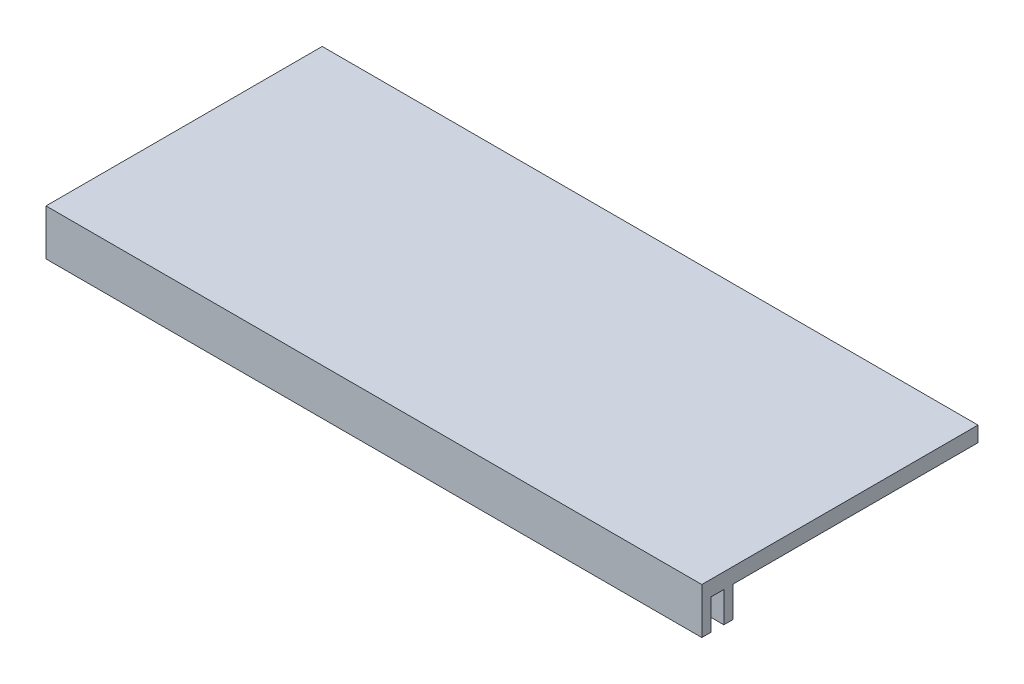
ISO-10303-21;
HEADER;
FILE_DESCRIPTION(('STEP AP214'),'2;1');
FILE_NAME('part.step','',(''),(''),'','','');
FILE_SCHEMA(('AUTOMOTIVE_DESIGN { 1 0 10303 214 1 1 1 1 }'));
ENDSEC;
DATA;
#1=APPLICATION_CONTEXT('core data for automotive mechanical design processes');
#2=APPLICATION_PROTOCOL_DEFINITION('international standard','automotive_design',2000,#1);
#3=PRODUCT_CONTEXT('',#1,'mechanical');
#4=PRODUCT('Part','Part','',(#3));
#5=PRODUCT_RELATED_PRODUCT_CATEGORY('part','',(#4));
#6=PRODUCT_DEFINITION_FORMATION('','',#4);
#7=PRODUCT_DEFINITION_CONTEXT('part definition',#1,'design');
#8=PRODUCT_DEFINITION('design','',#6,#7);
#9=PRODUCT_DEFINITION_SHAPE('','',#8);
#10=(LENGTH_UNIT() NAMED_UNIT(*) SI_UNIT(.MILLI.,.METRE.));
#11=(NAMED_UNIT(*) PLANE_ANGLE_UNIT() SI_UNIT($,.RADIAN.));
#12=(NAMED_UNIT(*) SI_UNIT($,.STERADIAN.) SOLID_ANGLE_UNIT());
#13=UNCERTAINTY_MEASURE_WITH_UNIT(LENGTH_MEASURE(1.E-05),#10,'distance_accuracy_value','');
#14=(GEOMETRIC_REPRESENTATION_CONTEXT(3) GLOBAL_UNCERTAINTY_ASSIGNED_CONTEXT((#13)) GLOBAL_UNIT_ASSIGNED_CONTEXT((#10,
#11,#12)) REPRESENTATION_CONTEXT('',''));
#15=CARTESIAN_POINT('',(0.,0.,0.));
#16=DIRECTION('',(0.,0.,1.));
#17=DIRECTION('',(1.,0.,0.));
#18=AXIS2_PLACEMENT_3D('',#15,#16,#17);
#19=CARTESIAN_POINT('',(0.,-10.,0.));
#20=DIRECTION('',(0.,-1.,0.));
#21=DIRECTION('',(0.,0.,-1.));
#22=AXIS2_PLACEMENT_3D('',#19,#20,#21);
#23=PLANE('',#22);
#24=DIRECTION('',(1.,0.,0.));
#25=VECTOR('',#24,1.);
#26=CARTESIAN_POINT('',(20.,-10.,3.));
#27=LINE('',#26,#25);
#28=CARTESIAN_POINT('',(-194.15892813726,-10.,2.99999999999999));
#29=VERTEX_POINT('',#28);
#30=CARTESIAN_POINT('',(20.,-10.,3.));
#31=VERTEX_POINT('',#30);
#32=EDGE_CURVE('E163',#29,#31,#27,.T.);
#33=ORIENTED_EDGE('',*,*,#32,.F.);
#34=DIRECTION('',(0.,0.,1.));
#35=VECTOR('',#34,1.);
#36=CARTESIAN_POINT('',(-194.15892813726,-10.,0.));
#37=LINE('',#36,#35);
#38=CARTESIAN_POINT('',(-194.15892813726,-10.,0.));
#39=VERTEX_POINT('',#38);
#40=EDGE_CURVE('E160',#39,#29,#37,.T.);
#41=ORIENTED_EDGE('',*,*,#40,.F.);
#42=DIRECTION('',(1.,0.,0.));
#43=VECTOR('',#42,1.);
#44=CARTESIAN_POINT('',(20.,-10.,0.));
#45=LINE('',#44,#43);
#46=CARTESIAN_POINT('',(20.,-10.,0.));
#47=VERTEX_POINT('',#46);
#48=EDGE_CURVE('E178',#39,#47,#45,.T.);
#49=ORIENTED_EDGE('',*,*,#48,.T.);
#50=DIRECTION('',(0.,0.,1.));
#51=VECTOR('',#50,1.);
#52=CARTESIAN_POINT('',(20.,-10.,0.));
#53=LINE('',#52,#51);
#54=EDGE_CURVE('E173',#47,#31,#53,.T.);
#55=ORIENTED_EDGE('',*,*,#54,.T.);
#56=EDGE_LOOP('',(#33,#41,#49,#55));
#57=FACE_BOUND('',#56,.T.);
#58=ADVANCED_FACE('F41',(#57),#23,.T.);
#59=CARTESIAN_POINT('',(20.,5.,0.));
#60=DIRECTION('',(-1.,0.,0.));
#61=DIRECTION('',(0.,0.,1.));
#62=AXIS2_PLACEMENT_3D('',#59,#60,#61);
#63=PLANE('',#62);
#64=DIRECTION('',(0.,0.,1.));
#65=VECTOR('',#64,1.);
#66=CARTESIAN_POINT('',(20.,0.,7.2));
#67=LINE('',#66,#65);
#68=CARTESIAN_POINT('',(20.,0.,3.));
#69=VERTEX_POINT('',#68);
#70=CARTESIAN_POINT('',(20.,0.,7.2));
#71=VERTEX_POINT('',#70);
#72=EDGE_CURVE('E124',#69,#71,#67,.T.);
#73=ORIENTED_EDGE('',*,*,#72,.F.);
#74=DIRECTION('',(0.,-1.,0.));
#75=VECTOR('',#74,1.);
#76=CARTESIAN_POINT('',(20.,0.,3.));
#77=LINE('',#76,#75);
#78=EDGE_CURVE('E168',#69,#31,#77,.T.);
#79=ORIENTED_EDGE('',*,*,#78,.T.);
#80=ORIENTED_EDGE('',*,*,#54,.F.);
#81=DIRECTION('',(0.,-1.,0.));
#82=VECTOR('',#81,1.);
#83=CARTESIAN_POINT('',(20.,5.,0.));
#84=LINE('',#83,#82);
#85=CARTESIAN_POINT('',(20.,0.,0.));
#86=VERTEX_POINT('',#85);
#87=EDGE_CURVE('E184',#86,#47,#84,.T.);
#88=ORIENTED_EDGE('',*,*,#87,.F.);
#89=DIRECTION('',(0.,0.,-1.));
#90=VECTOR('',#89,1.);
#91=CARTESIAN_POINT('',(20.,0.,0.));
#92=LINE('',#91,#90);
#93=CARTESIAN_POINT('',(20.,0.,-80.));
#94=VERTEX_POINT('',#93);
#95=EDGE_CURVE('E194',#86,#94,#92,.T.);
#96=ORIENTED_EDGE('',*,*,#95,.T.);
#97=DIRECTION('',(0.,-1.,0.));
#98=VECTOR('',#97,1.);
#99=CARTESIAN_POINT('',(20.,5.,-80.));
#100=LINE('',#99,#98);
#101=CARTESIAN_POINT('',(20.,5.,-80.));
#102=VERTEX_POINT('',#101);
#103=EDGE_CURVE('E11',#102,#94,#100,.T.);
#104=ORIENTED_EDGE('',*,*,#103,.F.);
#105=DIRECTION('',(0.,0.,-1.));
#106=VECTOR('',#105,1.);
#107=CARTESIAN_POINT('',(20.,5.,0.));
#108=LINE('',#107,#106);
#109=CARTESIAN_POINT('',(20.,5.,10.2));
#110=VERTEX_POINT('',#109);
#111=EDGE_CURVE('E65',#110,#102,#108,.T.);
#112=ORIENTED_EDGE('',*,*,#111,.F.);
#113=DIRECTION('',(0.,-1.,0.));
#114=VECTOR('',#113,1.);
#115=CARTESIAN_POINT('',(20.,5.,10.2));
#116=LINE('',#115,#114);
#117=CARTESIAN_POINT('',(20.,-10.,10.2));
#118=VERTEX_POINT('',#117);
#119=EDGE_CURVE('E183',#110,#118,#116,.T.);
#120=ORIENTED_EDGE('',*,*,#119,.T.);
#121=CARTESIAN_POINT('',(20.,-10.,7.2));
#122=VERTEX_POINT('',#121);
#123=EDGE_CURVE('E171',#122,#118,#53,.T.);
#124=ORIENTED_EDGE('',*,*,#123,.F.);
#125=DIRECTION('',(0.,-1.,0.));
#126=VECTOR('',#125,1.);
#127=CARTESIAN_POINT('',(20.,0.,7.2));
#128=LINE('',#127,#126);
#129=EDGE_CURVE('E56',#71,#122,#128,.T.);
#130=ORIENTED_EDGE('',*,*,#129,.F.);
#131=EDGE_LOOP('',(#73,#79,#80,#88,#96,#104,#112,#120,#124,#130));
#132=FACE_BOUND('',#131,.T.);
#133=ADVANCED_FACE('F43',(#132),#63,.F.);
#134=CARTESIAN_POINT('',(0.,5.,-80.));
#135=DIRECTION('',(0.,0.,1.));
#136=DIRECTION('',(1.,0.,0.));
#137=AXIS2_PLACEMENT_3D('',#134,#135,#136);
#138=PLANE('',#137);
#139=DIRECTION('',(-1.,0.,0.));
#140=VECTOR('',#139,1.);
#141=CARTESIAN_POINT('',(0.,0.,-80.));
#142=LINE('',#141,#140);
#143=CARTESIAN_POINT('',(-194.15892813726,0.,-80.));
#144=VERTEX_POINT('',#143);
#145=EDGE_CURVE('E190',#94,#144,#142,.T.);
#146=ORIENTED_EDGE('',*,*,#145,.T.);
#147=DIRECTION('',(0.,-1.,0.));
#148=VECTOR('',#147,1.);
#149=CARTESIAN_POINT('',(-194.15892813726,0.,-80.));
#150=LINE('',#149,#148);
#151=CARTESIAN_POINT('',(-194.15892813726,5.,-80.));
#152=VERTEX_POINT('',#151);
#153=EDGE_CURVE('E151',#152,#144,#150,.T.);
#154=ORIENTED_EDGE('',*,*,#153,.F.);
#155=DIRECTION('',(-1.,0.,0.));
#156=VECTOR('',#155,1.);
#157=CARTESIAN_POINT('',(0.,5.,-80.));
#158=LINE('',#157,#156);
#159=EDGE_CURVE('E49',#102,#152,#158,.T.);
#160=ORIENTED_EDGE('',*,*,#159,.F.);
#161=ORIENTED_EDGE('',*,*,#103,.T.);
#162=EDGE_LOOP('',(#146,#154,#160,#161));
#163=FACE_BOUND('',#162,.T.);
#164=ADVANCED_FACE('F198',(#163),#138,.F.);
#165=CARTESIAN_POINT('',(0.,5.,0.));
#166=DIRECTION('',(0.,-1.,0.));
#167=DIRECTION('',(0.,0.,-1.));
#168=AXIS2_PLACEMENT_3D('',#165,#166,#167);
#169=PLANE('',#168);
#170=ORIENTED_EDGE('',*,*,#159,.T.);
#171=DIRECTION('',(0.,0.,-1.));
#172=VECTOR('',#171,1.);
#173=CARTESIAN_POINT('',(-194.15892813726,5.,0.));
#174=LINE('',#173,#172);
#175=CARTESIAN_POINT('',(-194.15892813726,5.,10.2));
#176=VERTEX_POINT('',#175);
#177=EDGE_CURVE('E148',#176,#152,#174,.T.);
#178=ORIENTED_EDGE('',*,*,#177,.F.);
#179=DIRECTION('',(-1.,0.,0.));
#180=VECTOR('',#179,1.);
#181=CARTESIAN_POINT('',(20.,5.,10.2));
#182=LINE('',#181,#180);
#183=EDGE_CURVE('E181',#110,#176,#182,.T.);
#184=ORIENTED_EDGE('',*,*,#183,.F.);
#185=ORIENTED_EDGE('',*,*,#111,.T.);
#186=EDGE_LOOP('',(#170,#178,#184,#185));
#187=FACE_BOUND('',#186,.T.);
#188=ADVANCED_FACE('F222',(#187),#169,.F.);
#189=CARTESIAN_POINT('',(0.,0.,0.));
#190=DIRECTION('',(0.,-1.,0.));
#191=DIRECTION('',(0.,0.,-1.));
#192=AXIS2_PLACEMENT_3D('',#189,#190,#191);
#193=PLANE('',#192);
#194=DIRECTION('',(1.,0.,0.));
#195=VECTOR('',#194,1.);
#196=CARTESIAN_POINT('',(0.,0.,0.));
#197=LINE('',#196,#195);
#198=CARTESIAN_POINT('',(-194.15892813726,0.,0.));
#199=VERTEX_POINT('',#198);
#200=EDGE_CURVE('E186',#199,#86,#197,.T.);
#201=ORIENTED_EDGE('',*,*,#200,.F.);
#202=DIRECTION('',(0.,0.,1.));
#203=VECTOR('',#202,1.);
#204=CARTESIAN_POINT('',(-194.15892813726,0.,0.));
#205=LINE('',#204,#203);
#206=EDGE_CURVE('E154',#144,#199,#205,.T.);
#207=ORIENTED_EDGE('',*,*,#206,.F.);
#208=ORIENTED_EDGE('',*,*,#145,.F.);
#209=ORIENTED_EDGE('',*,*,#95,.F.);
#210=EDGE_LOOP('',(#201,#207,#208,#209));
#211=FACE_BOUND('',#210,.T.);
#212=ADVANCED_FACE('F204',(#211),#193,.T.);
#213=CARTESIAN_POINT('',(20.,5.,0.));
#214=DIRECTION('',(0.,0.,-1.));
#215=DIRECTION('',(-1.,0.,0.));
#216=AXIS2_PLACEMENT_3D('',#213,#214,#215);
#217=PLANE('',#216);
#218=ORIENTED_EDGE('',*,*,#48,.F.);
#219=DIRECTION('',(0.,-1.,0.));
#220=VECTOR('',#219,1.);
#221=CARTESIAN_POINT('',(-194.15892813726,0.,0.));
#222=LINE('',#221,#220);
#223=EDGE_CURVE('E157',#199,#39,#222,.T.);
#224=ORIENTED_EDGE('',*,*,#223,.F.);
#225=ORIENTED_EDGE('',*,*,#200,.T.);
#226=ORIENTED_EDGE('',*,*,#87,.T.);
#227=EDGE_LOOP('',(#218,#224,#225,#226));
#228=FACE_BOUND('',#227,.T.);
#229=ADVANCED_FACE('F207',(#228),#217,.T.);
#230=CARTESIAN_POINT('',(20.,5.,10.2));
#231=DIRECTION('',(0.,0.,1.));
#232=DIRECTION('',(1.,0.,0.));
#233=AXIS2_PLACEMENT_3D('',#230,#231,#232);
#234=PLANE('',#233);
#235=ORIENTED_EDGE('',*,*,#183,.T.);
#236=DIRECTION('',(0.,1.,0.));
#237=VECTOR('',#236,1.);
#238=CARTESIAN_POINT('',(-194.15892813726,0.,10.2));
#239=LINE('',#238,#237);
#240=CARTESIAN_POINT('',(-194.15892813726,-10.,10.2));
#241=VERTEX_POINT('',#240);
#242=EDGE_CURVE('E143',#241,#176,#239,.T.);
#243=ORIENTED_EDGE('',*,*,#242,.F.);
#244=DIRECTION('',(-1.,0.,0.));
#245=VECTOR('',#244,1.);
#246=CARTESIAN_POINT('',(20.,-10.,10.2));
#247=LINE('',#246,#245);
#248=EDGE_CURVE('E176',#118,#241,#247,.T.);
#249=ORIENTED_EDGE('',*,*,#248,.F.);
#250=ORIENTED_EDGE('',*,*,#119,.F.);
#251=EDGE_LOOP('',(#235,#243,#249,#250));
#252=FACE_BOUND('',#251,.T.);
#253=ADVANCED_FACE('F221',(#252),#234,.T.);
#254=DIRECTION('',(-1.,0.,0.));
#255=VECTOR('',#254,1.);
#256=CARTESIAN_POINT('',(20.,-10.,7.2));
#257=LINE('',#256,#255);
#258=CARTESIAN_POINT('',(-194.15892813726,-10.,7.2));
#259=VERTEX_POINT('',#258);
#260=EDGE_CURVE('E139',#122,#259,#257,.T.);
#261=ORIENTED_EDGE('',*,*,#260,.F.);
#262=ORIENTED_EDGE('',*,*,#123,.T.);
#263=ORIENTED_EDGE('',*,*,#248,.T.);
#264=DIRECTION('',(0.,0.,1.));
#265=VECTOR('',#264,1.);
#266=CARTESIAN_POINT('',(-194.15892813726,-10.,0.));
#267=LINE('',#266,#265);
#268=EDGE_CURVE('E141',#259,#241,#267,.T.);
#269=ORIENTED_EDGE('',*,*,#268,.F.);
#270=EDGE_LOOP('',(#261,#262,#263,#269));
#271=FACE_BOUND('',#270,.T.);
#272=ADVANCED_FACE('F218',(#271),#23,.T.);
#273=CARTESIAN_POINT('',(20.,0.,3.));
#274=DIRECTION('',(0.,0.,-1.));
#275=DIRECTION('',(-1.,0.,0.));
#276=AXIS2_PLACEMENT_3D('',#273,#274,#275);
#277=PLANE('',#276);
#278=ORIENTED_EDGE('',*,*,#32,.T.);
#279=ORIENTED_EDGE('',*,*,#78,.F.);
#280=DIRECTION('',(1.,0.,0.));
#281=VECTOR('',#280,1.);
#282=CARTESIAN_POINT('',(20.,0.,3.));
#283=LINE('',#282,#281);
#284=CARTESIAN_POINT('',(-194.15892813726,0.,2.99999999999999));
#285=VERTEX_POINT('',#284);
#286=EDGE_CURVE('E126',#285,#69,#283,.T.);
#287=ORIENTED_EDGE('',*,*,#286,.F.);
#288=DIRECTION('',(0.,1.,0.));
#289=VECTOR('',#288,1.);
#290=CARTESIAN_POINT('',(-194.15892813726,0.,2.99999999999999));
#291=LINE('',#290,#289);
#292=EDGE_CURVE('E136',#29,#285,#291,.T.);
#293=ORIENTED_EDGE('',*,*,#292,.F.);
#294=EDGE_LOOP('',(#278,#279,#287,#293));
#295=FACE_BOUND('',#294,.T.);
#296=ADVANCED_FACE('F213',(#295),#277,.F.);
#297=CARTESIAN_POINT('',(20.,0.,7.2));
#298=DIRECTION('',(0.,0.,1.));
#299=DIRECTION('',(1.,0.,0.));
#300=AXIS2_PLACEMENT_3D('',#297,#298,#299);
#301=PLANE('',#300);
#302=ORIENTED_EDGE('',*,*,#260,.T.);
#303=DIRECTION('',(0.,1.,0.));
#304=VECTOR('',#303,1.);
#305=CARTESIAN_POINT('',(-194.15892813726,0.,7.2));
#306=LINE('',#305,#304);
#307=CARTESIAN_POINT('',(-194.15892813726,0.,7.2));
#308=VERTEX_POINT('',#307);
#309=EDGE_CURVE('E133',#259,#308,#306,.T.);
#310=ORIENTED_EDGE('',*,*,#309,.T.);
#311=DIRECTION('',(-1.,0.,0.));
#312=VECTOR('',#311,1.);
#313=CARTESIAN_POINT('',(20.,0.,7.2));
#314=LINE('',#313,#312);
#315=EDGE_CURVE('E118',#71,#308,#314,.T.);
#316=ORIENTED_EDGE('',*,*,#315,.F.);
#317=ORIENTED_EDGE('',*,*,#129,.T.);
#318=EDGE_LOOP('',(#302,#310,#316,#317));
#319=FACE_BOUND('',#318,.T.);
#320=ADVANCED_FACE('F138',(#319),#301,.F.);
#321=CARTESIAN_POINT('',(0.,0.,0.));
#322=DIRECTION('',(0.,1.,0.));
#323=DIRECTION('',(0.,0.,1.));
#324=AXIS2_PLACEMENT_3D('',#321,#322,#323);
#325=PLANE('',#324);
#326=ORIENTED_EDGE('',*,*,#72,.T.);
#327=ORIENTED_EDGE('',*,*,#315,.T.);
#328=DIRECTION('',(0.,0.,1.));
#329=VECTOR('',#328,1.);
#330=CARTESIAN_POINT('',(-194.15892813726,0.,0.));
#331=LINE('',#330,#329);
#332=EDGE_CURVE('E122',#285,#308,#331,.T.);
#333=ORIENTED_EDGE('',*,*,#332,.F.);
#334=ORIENTED_EDGE('',*,*,#286,.T.);
#335=EDGE_LOOP('',(#326,#327,#333,#334));
#336=FACE_BOUND('',#335,.T.);
#337=ADVANCED_FACE('F120',(#336),#325,.F.);
#338=CARTESIAN_POINT('',(-194.15892813726,0.,0.));
#339=DIRECTION('',(-1.,0.,0.));
#340=DIRECTION('',(0.,0.,1.));
#341=AXIS2_PLACEMENT_3D('',#338,#339,#340);
#342=PLANE('',#341);
#343=ORIENTED_EDGE('',*,*,#332,.T.);
#344=ORIENTED_EDGE('',*,*,#309,.F.);
#345=ORIENTED_EDGE('',*,*,#268,.T.);
#346=ORIENTED_EDGE('',*,*,#242,.T.);
#347=ORIENTED_EDGE('',*,*,#177,.T.);
#348=ORIENTED_EDGE('',*,*,#153,.T.);
#349=ORIENTED_EDGE('',*,*,#206,.T.);
#350=ORIENTED_EDGE('',*,*,#223,.T.);
#351=ORIENTED_EDGE('',*,*,#40,.T.);
#352=ORIENTED_EDGE('',*,*,#292,.T.);
#353=EDGE_LOOP('',(#343,#344,#345,#346,#347,#348,#349,#350,#351,#352));
#354=FACE_BOUND('',#353,.T.);
#355=ADVANCED_FACE('F131',(#354),#342,.T.);
#356=CLOSED_SHELL('',(#58,#133,#164,#188,#212,#229,#253,#272,#296,#320,#337,#355));
#357=MANIFOLD_SOLID_BREP('B2',#356);
#358=ADVANCED_BREP_SHAPE_REPRESENTATION('',(#18,#357),#14);
#359=SHAPE_DEFINITION_REPRESENTATION(#9,#358);
ENDSEC;
END-ISO-10303-21;
